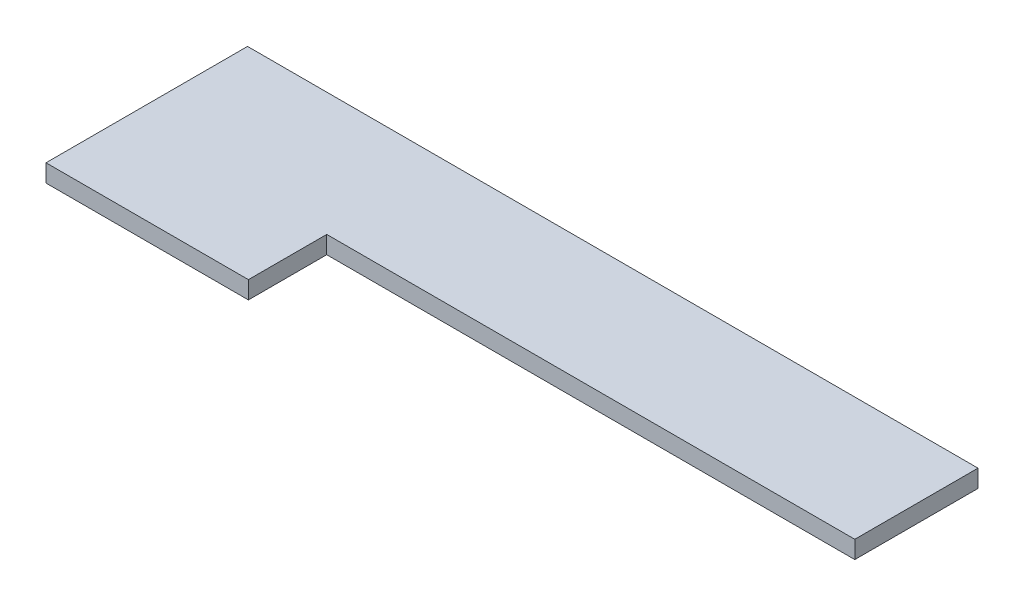
ISO-10303-21;
HEADER;
FILE_DESCRIPTION(('STEP AP214'),'2;1');
FILE_NAME('part.step','',(''),(''),'','','');
FILE_SCHEMA(('AUTOMOTIVE_DESIGN { 1 0 10303 214 1 1 1 1 }'));
ENDSEC;
DATA;
#1=APPLICATION_CONTEXT('core data for automotive mechanical design processes');
#2=APPLICATION_PROTOCOL_DEFINITION('international standard','automotive_design',2000,#1);
#3=PRODUCT_CONTEXT('',#1,'mechanical');
#4=PRODUCT('Part','Part','',(#3));
#5=PRODUCT_RELATED_PRODUCT_CATEGORY('part','',(#4));
#6=PRODUCT_DEFINITION_FORMATION('','',#4);
#7=PRODUCT_DEFINITION_CONTEXT('part definition',#1,'design');
#8=PRODUCT_DEFINITION('design','',#6,#7);
#9=PRODUCT_DEFINITION_SHAPE('','',#8);
#10=(LENGTH_UNIT() NAMED_UNIT(*) SI_UNIT(.MILLI.,.METRE.));
#11=(NAMED_UNIT(*) PLANE_ANGLE_UNIT() SI_UNIT($,.RADIAN.));
#12=(NAMED_UNIT(*) SI_UNIT($,.STERADIAN.) SOLID_ANGLE_UNIT());
#13=UNCERTAINTY_MEASURE_WITH_UNIT(LENGTH_MEASURE(1.E-05),#10,'distance_accuracy_value','');
#14=(GEOMETRIC_REPRESENTATION_CONTEXT(3) GLOBAL_UNCERTAINTY_ASSIGNED_CONTEXT((#13)) GLOBAL_UNIT_ASSIGNED_CONTEXT((#10,
#11,#12)) REPRESENTATION_CONTEXT('',''));
#15=CARTESIAN_POINT('',(0.,0.,0.));
#16=DIRECTION('',(0.,0.,1.));
#17=DIRECTION('',(1.,0.,0.));
#18=AXIS2_PLACEMENT_3D('',#15,#16,#17);
#19=CARTESIAN_POINT('',(-5.,1.,-7.73));
#20=DIRECTION('',(1.,0.,0.));
#21=DIRECTION('',(0.,0.,-1.));
#22=AXIS2_PLACEMENT_3D('',#19,#20,#21);
#23=PLANE('',#22);
#24=DIRECTION('',(0.,0.,1.));
#25=VECTOR('',#24,1.);
#26=CARTESIAN_POINT('',(-5.,0.,-7.73));
#27=LINE('',#26,#25);
#28=CARTESIAN_POINT('',(-5.,0.,-7.73));
#29=VERTEX_POINT('',#28);
#30=CARTESIAN_POINT('',(-5.,0.,3.72));
#31=VERTEX_POINT('',#30);
#32=EDGE_CURVE('E122',#29,#31,#27,.T.);
#33=ORIENTED_EDGE('',*,*,#32,.T.);
#34=DIRECTION('',(0.,-1.,0.));
#35=VECTOR('',#34,1.);
#36=CARTESIAN_POINT('',(-5.,1.,3.72));
#37=LINE('',#36,#35);
#38=CARTESIAN_POINT('',(-5.,1.,3.72));
#39=VERTEX_POINT('',#38);
#40=EDGE_CURVE('E11',#39,#31,#37,.T.);
#41=ORIENTED_EDGE('',*,*,#40,.F.);
#42=DIRECTION('',(0.,0.,1.));
#43=VECTOR('',#42,1.);
#44=CARTESIAN_POINT('',(-5.,1.,-7.73));
#45=LINE('',#44,#43);
#46=CARTESIAN_POINT('',(-5.,1.,-7.73));
#47=VERTEX_POINT('',#46);
#48=EDGE_CURVE('E133',#47,#39,#45,.T.);
#49=ORIENTED_EDGE('',*,*,#48,.F.);
#50=DIRECTION('',(0.,-1.,0.));
#51=VECTOR('',#50,1.);
#52=CARTESIAN_POINT('',(-5.,1.,-7.73));
#53=LINE('',#52,#51);
#54=EDGE_CURVE('E118',#47,#29,#53,.T.);
#55=ORIENTED_EDGE('',*,*,#54,.T.);
#56=EDGE_LOOP('',(#33,#41,#49,#55));
#57=FACE_BOUND('',#56,.T.);
#58=ADVANCED_FACE('F37',(#57),#23,.F.);
#59=CARTESIAN_POINT('',(-5.,1.,3.72));
#60=DIRECTION('',(0.,0.,-1.));
#61=DIRECTION('',(-1.,0.,0.));
#62=AXIS2_PLACEMENT_3D('',#59,#60,#61);
#63=PLANE('',#62);
#64=DIRECTION('',(1.,0.,0.));
#65=VECTOR('',#64,1.);
#66=CARTESIAN_POINT('',(-5.,0.,3.72));
#67=LINE('',#66,#65);
#68=CARTESIAN_POINT('',(6.5,0.,3.72));
#69=VERTEX_POINT('',#68);
#70=EDGE_CURVE('E125',#31,#69,#67,.T.);
#71=ORIENTED_EDGE('',*,*,#70,.T.);
#72=DIRECTION('',(0.,-1.,0.));
#73=VECTOR('',#72,1.);
#74=CARTESIAN_POINT('',(6.5,1.,3.72));
#75=LINE('',#74,#73);
#76=CARTESIAN_POINT('',(6.5,1.,3.72));
#77=VERTEX_POINT('',#76);
#78=EDGE_CURVE('E45',#77,#69,#75,.T.);
#79=ORIENTED_EDGE('',*,*,#78,.F.);
#80=DIRECTION('',(1.,0.,0.));
#81=VECTOR('',#80,1.);
#82=CARTESIAN_POINT('',(-5.,1.,3.72));
#83=LINE('',#82,#81);
#84=EDGE_CURVE('E88',#39,#77,#83,.T.);
#85=ORIENTED_EDGE('',*,*,#84,.F.);
#86=ORIENTED_EDGE('',*,*,#40,.T.);
#87=EDGE_LOOP('',(#71,#79,#85,#86));
#88=FACE_BOUND('',#87,.T.);
#89=ADVANCED_FACE('F147',(#88),#63,.F.);
#90=CARTESIAN_POINT('',(6.5,1.,-0.729999999999999));
#91=DIRECTION('',(-1.,0.,0.));
#92=DIRECTION('',(0.,0.,1.));
#93=AXIS2_PLACEMENT_3D('',#90,#91,#92);
#94=PLANE('',#93);
#95=DIRECTION('',(0.,0.,-1.));
#96=VECTOR('',#95,1.);
#97=CARTESIAN_POINT('',(6.5,0.,-0.729999999999999));
#98=LINE('',#97,#96);
#99=CARTESIAN_POINT('',(6.5,0.,-0.729999999999999));
#100=VERTEX_POINT('',#99);
#101=EDGE_CURVE('E127',#69,#100,#98,.T.);
#102=ORIENTED_EDGE('',*,*,#101,.T.);
#103=DIRECTION('',(0.,-1.,0.));
#104=VECTOR('',#103,1.);
#105=CARTESIAN_POINT('',(6.5,1.,-0.729999999999999));
#106=LINE('',#105,#104);
#107=CARTESIAN_POINT('',(6.5,1.,-0.729999999999999));
#108=VERTEX_POINT('',#107);
#109=EDGE_CURVE('E113',#108,#100,#106,.T.);
#110=ORIENTED_EDGE('',*,*,#109,.F.);
#111=DIRECTION('',(0.,0.,-1.));
#112=VECTOR('',#111,1.);
#113=CARTESIAN_POINT('',(6.5,1.,-0.729999999999999));
#114=LINE('',#113,#112);
#115=EDGE_CURVE('E102',#77,#108,#114,.T.);
#116=ORIENTED_EDGE('',*,*,#115,.F.);
#117=ORIENTED_EDGE('',*,*,#78,.T.);
#118=EDGE_LOOP('',(#102,#110,#116,#117));
#119=FACE_BOUND('',#118,.T.);
#120=ADVANCED_FACE('F139',(#119),#94,.F.);
#121=CARTESIAN_POINT('',(36.5,1.,-0.73));
#122=DIRECTION('',(0.,0.,-1.));
#123=DIRECTION('',(-1.,0.,0.));
#124=AXIS2_PLACEMENT_3D('',#121,#122,#123);
#125=PLANE('',#124);
#126=DIRECTION('',(1.,0.,0.));
#127=VECTOR('',#126,1.);
#128=CARTESIAN_POINT('',(36.5,0.,-0.73));
#129=LINE('',#128,#127);
#130=CARTESIAN_POINT('',(36.5,0.,-0.73));
#131=VERTEX_POINT('',#130);
#132=EDGE_CURVE('E111',#100,#131,#129,.T.);
#133=ORIENTED_EDGE('',*,*,#132,.T.);
#134=DIRECTION('',(0.,-1.,0.));
#135=VECTOR('',#134,1.);
#136=CARTESIAN_POINT('',(36.5,1.,-0.73));
#137=LINE('',#136,#135);
#138=CARTESIAN_POINT('',(36.5,1.,-0.73));
#139=VERTEX_POINT('',#138);
#140=EDGE_CURVE('E108',#139,#131,#137,.T.);
#141=ORIENTED_EDGE('',*,*,#140,.F.);
#142=DIRECTION('',(1.,0.,0.));
#143=VECTOR('',#142,1.);
#144=CARTESIAN_POINT('',(36.5,1.,-0.73));
#145=LINE('',#144,#143);
#146=EDGE_CURVE('E95',#108,#139,#145,.T.);
#147=ORIENTED_EDGE('',*,*,#146,.F.);
#148=ORIENTED_EDGE('',*,*,#109,.T.);
#149=EDGE_LOOP('',(#133,#141,#147,#148));
#150=FACE_BOUND('',#149,.T.);
#151=ADVANCED_FACE('F109',(#150),#125,.F.);
#152=CARTESIAN_POINT('',(36.5,1.,-7.73));
#153=DIRECTION('',(-1.,0.,0.));
#154=DIRECTION('',(0.,0.,1.));
#155=AXIS2_PLACEMENT_3D('',#152,#153,#154);
#156=PLANE('',#155);
#157=DIRECTION('',(0.,0.,-1.));
#158=VECTOR('',#157,1.);
#159=CARTESIAN_POINT('',(36.5,0.,-7.73));
#160=LINE('',#159,#158);
#161=CARTESIAN_POINT('',(36.5,0.,-7.73));
#162=VERTEX_POINT('',#161);
#163=EDGE_CURVE('E130',#131,#162,#160,.T.);
#164=ORIENTED_EDGE('',*,*,#163,.T.);
#165=DIRECTION('',(0.,-1.,0.));
#166=VECTOR('',#165,1.);
#167=CARTESIAN_POINT('',(36.5,1.,-7.73));
#168=LINE('',#167,#166);
#169=CARTESIAN_POINT('',(36.5,1.,-7.73));
#170=VERTEX_POINT('',#169);
#171=EDGE_CURVE('E114',#170,#162,#168,.T.);
#172=ORIENTED_EDGE('',*,*,#171,.F.);
#173=DIRECTION('',(0.,0.,-1.));
#174=VECTOR('',#173,1.);
#175=CARTESIAN_POINT('',(36.5,1.,-7.73));
#176=LINE('',#175,#174);
#177=EDGE_CURVE('E99',#139,#170,#176,.T.);
#178=ORIENTED_EDGE('',*,*,#177,.F.);
#179=ORIENTED_EDGE('',*,*,#140,.T.);
#180=EDGE_LOOP('',(#164,#172,#178,#179));
#181=FACE_BOUND('',#180,.T.);
#182=ADVANCED_FACE('F116',(#181),#156,.F.);
#183=CARTESIAN_POINT('',(-5.,1.,-7.73));
#184=DIRECTION('',(0.,0.,1.));
#185=DIRECTION('',(1.,0.,0.));
#186=AXIS2_PLACEMENT_3D('',#183,#184,#185);
#187=PLANE('',#186);
#188=DIRECTION('',(-1.,0.,0.));
#189=VECTOR('',#188,1.);
#190=CARTESIAN_POINT('',(-5.,0.,-7.73));
#191=LINE('',#190,#189);
#192=EDGE_CURVE('E76',#162,#29,#191,.T.);
#193=ORIENTED_EDGE('',*,*,#192,.T.);
#194=ORIENTED_EDGE('',*,*,#54,.F.);
#195=DIRECTION('',(-1.,0.,0.));
#196=VECTOR('',#195,1.);
#197=CARTESIAN_POINT('',(6.5,1.,-7.73));
#198=LINE('',#197,#196);
#199=EDGE_CURVE('E53',#170,#47,#198,.T.);
#200=ORIENTED_EDGE('',*,*,#199,.F.);
#201=ORIENTED_EDGE('',*,*,#171,.T.);
#202=EDGE_LOOP('',(#193,#194,#200,#201));
#203=FACE_BOUND('',#202,.T.);
#204=ADVANCED_FACE('F141',(#203),#187,.F.);
#205=CARTESIAN_POINT('',(0.,1.,0.));
#206=DIRECTION('',(0.,1.,0.));
#207=DIRECTION('',(0.,0.,1.));
#208=AXIS2_PLACEMENT_3D('',#205,#206,#207);
#209=PLANE('',#208);
#210=ORIENTED_EDGE('',*,*,#48,.T.);
#211=ORIENTED_EDGE('',*,*,#84,.T.);
#212=ORIENTED_EDGE('',*,*,#115,.T.);
#213=ORIENTED_EDGE('',*,*,#146,.T.);
#214=ORIENTED_EDGE('',*,*,#177,.T.);
#215=ORIENTED_EDGE('',*,*,#199,.T.);
#216=EDGE_LOOP('',(#210,#211,#212,#213,#214,#215));
#217=FACE_BOUND('',#216,.T.);
#218=ADVANCED_FACE('F97',(#217),#209,.T.);
#219=CARTESIAN_POINT('',(0.,0.,0.));
#220=DIRECTION('',(0.,1.,0.));
#221=DIRECTION('',(0.,0.,1.));
#222=AXIS2_PLACEMENT_3D('',#219,#220,#221);
#223=PLANE('',#222);
#224=ORIENTED_EDGE('',*,*,#32,.F.);
#225=ORIENTED_EDGE('',*,*,#192,.F.);
#226=ORIENTED_EDGE('',*,*,#163,.F.);
#227=ORIENTED_EDGE('',*,*,#132,.F.);
#228=ORIENTED_EDGE('',*,*,#101,.F.);
#229=ORIENTED_EDGE('',*,*,#70,.F.);
#230=EDGE_LOOP('',(#224,#225,#226,#227,#228,#229));
#231=FACE_BOUND('',#230,.T.);
#232=ADVANCED_FACE('F140',(#231),#223,.F.);
#233=CLOSED_SHELL('',(#58,#89,#120,#151,#182,#204,#218,#232));
#234=MANIFOLD_SOLID_BREP('B2',#233);
#235=ADVANCED_BREP_SHAPE_REPRESENTATION('',(#18,#234),#14);
#236=SHAPE_DEFINITION_REPRESENTATION(#9,#235);
ENDSEC;
END-ISO-10303-21;
